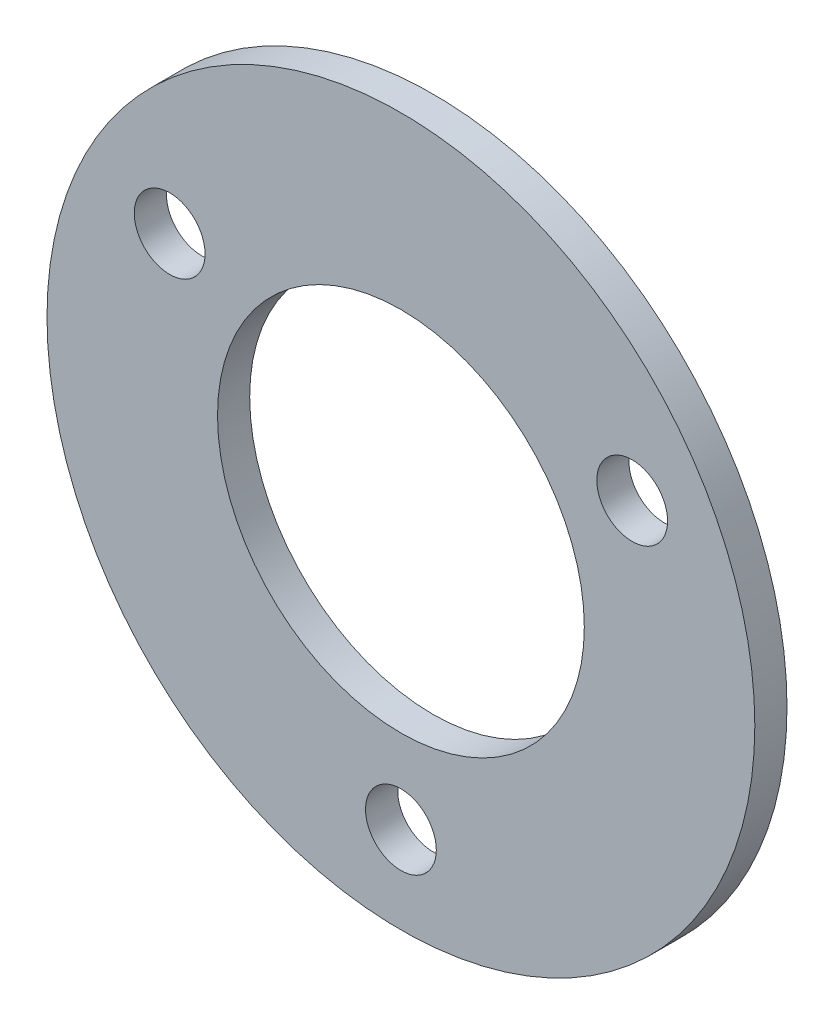
ISO-10303-21;
HEADER;
FILE_DESCRIPTION(('STEP AP214'),'2;1');
FILE_NAME('part.step','',(''),(''),'','','');
FILE_SCHEMA(('AUTOMOTIVE_DESIGN { 1 0 10303 214 1 1 1 1 }'));
ENDSEC;
DATA;
#1=APPLICATION_CONTEXT('core data for automotive mechanical design processes');
#2=APPLICATION_PROTOCOL_DEFINITION('international standard','automotive_design',2000,#1);
#3=PRODUCT_CONTEXT('',#1,'mechanical');
#4=PRODUCT('Part','Part','',(#3));
#5=PRODUCT_RELATED_PRODUCT_CATEGORY('part','',(#4));
#6=PRODUCT_DEFINITION_FORMATION('','',#4);
#7=PRODUCT_DEFINITION_CONTEXT('part definition',#1,'design');
#8=PRODUCT_DEFINITION('design','',#6,#7);
#9=PRODUCT_DEFINITION_SHAPE('','',#8);
#10=(LENGTH_UNIT() NAMED_UNIT(*) SI_UNIT(.MILLI.,.METRE.));
#11=(NAMED_UNIT(*) PLANE_ANGLE_UNIT() SI_UNIT($,.RADIAN.));
#12=(NAMED_UNIT(*) SI_UNIT($,.STERADIAN.) SOLID_ANGLE_UNIT());
#13=UNCERTAINTY_MEASURE_WITH_UNIT(LENGTH_MEASURE(1.E-05),#10,'distance_accuracy_value','');
#14=(GEOMETRIC_REPRESENTATION_CONTEXT(3) GLOBAL_UNCERTAINTY_ASSIGNED_CONTEXT((#13)) GLOBAL_UNIT_ASSIGNED_CONTEXT((#10,
#11,#12)) REPRESENTATION_CONTEXT('',''));
#15=CARTESIAN_POINT('',(0.,0.,0.));
#16=DIRECTION('',(0.,0.,1.));
#17=DIRECTION('',(1.,0.,0.));
#18=AXIS2_PLACEMENT_3D('',#15,#16,#17);
#19=CARTESIAN_POINT('',(0.,0.,1.));
#20=DIRECTION('',(0.,0.,1.));
#21=DIRECTION('',(1.,0.,0.));
#22=AXIS2_PLACEMENT_3D('',#19,#20,#21);
#23=PLANE('',#22);
#24=CARTESIAN_POINT('',(-7.18801085141084,4.15,1.));
#25=DIRECTION('',(0.,0.,1.));
#26=DIRECTION('',(1.,0.,0.));
#27=AXIS2_PLACEMENT_3D('',#24,#25,#26);
#28=CIRCLE('',#27,1.1);
#29=CARTESIAN_POINT('',(-6.08801085141084,4.15,1.));
#30=VERTEX_POINT('',#29);
#31=EDGE_CURVE('E56',#30,#30,#28,.T.);
#32=ORIENTED_EDGE('',*,*,#31,.F.);
#33=EDGE_LOOP('',(#32));
#34=FACE_BOUND('',#33,.T.);
#35=CARTESIAN_POINT('',(0.,0.,1.));
#36=DIRECTION('',(0.,0.,1.));
#37=DIRECTION('',(1.,0.,0.));
#38=AXIS2_PLACEMENT_3D('',#35,#36,#37);
#39=CIRCLE('',#38,5.7);
#40=CARTESIAN_POINT('',(5.7,0.,1.));
#41=VERTEX_POINT('',#40);
#42=EDGE_CURVE('E48',#41,#41,#39,.T.);
#43=ORIENTED_EDGE('',*,*,#42,.F.);
#44=EDGE_LOOP('',(#43));
#45=FACE_BOUND('',#44,.T.);
#46=CARTESIAN_POINT('',(0.,0.,1.));
#47=DIRECTION('',(0.,0.,1.));
#48=DIRECTION('',(1.,0.,0.));
#49=AXIS2_PLACEMENT_3D('',#46,#47,#48);
#50=CIRCLE('',#49,11.);
#51=CARTESIAN_POINT('',(11.,0.,1.));
#52=VERTEX_POINT('',#51);
#53=EDGE_CURVE('E10',#52,#52,#50,.T.);
#54=ORIENTED_EDGE('',*,*,#53,.T.);
#55=EDGE_LOOP('',(#54));
#56=FACE_BOUND('',#55,.T.);
#57=CARTESIAN_POINT('',(7.18801085141084,4.15,1.));
#58=DIRECTION('',(0.,0.,1.));
#59=DIRECTION('',(1.,0.,0.));
#60=AXIS2_PLACEMENT_3D('',#57,#58,#59);
#61=CIRCLE('',#60,1.1);
#62=CARTESIAN_POINT('',(8.28801085141084,4.15,1.));
#63=VERTEX_POINT('',#62);
#64=EDGE_CURVE('E52',#63,#63,#61,.T.);
#65=ORIENTED_EDGE('',*,*,#64,.F.);
#66=EDGE_LOOP('',(#65));
#67=FACE_BOUND('',#66,.T.);
#68=CARTESIAN_POINT('',(0.,-8.3,1.));
#69=DIRECTION('',(0.,0.,1.));
#70=DIRECTION('',(1.,0.,0.));
#71=AXIS2_PLACEMENT_3D('',#68,#69,#70);
#72=CIRCLE('',#71,1.1);
#73=CARTESIAN_POINT('',(1.1,-8.3,1.));
#74=VERTEX_POINT('',#73);
#75=EDGE_CURVE('E63',#74,#74,#72,.T.);
#76=ORIENTED_EDGE('',*,*,#75,.F.);
#77=EDGE_LOOP('',(#76));
#78=FACE_BOUND('',#77,.T.);
#79=ADVANCED_FACE('F40',(#34,#45,#56,#67,#78),#23,.T.);
#80=CARTESIAN_POINT('',(0.,0.,0.));
#81=DIRECTION('',(0.,0.,1.));
#82=DIRECTION('',(1.,0.,0.));
#83=AXIS2_PLACEMENT_3D('',#80,#81,#82);
#84=PLANE('',#83);
#85=CARTESIAN_POINT('',(0.,0.,0.));
#86=DIRECTION('',(0.,0.,1.));
#87=DIRECTION('',(1.,0.,0.));
#88=AXIS2_PLACEMENT_3D('',#85,#86,#87);
#89=CIRCLE('',#88,11.);
#90=CARTESIAN_POINT('',(11.,0.,0.));
#91=VERTEX_POINT('',#90);
#92=EDGE_CURVE('E41',#91,#91,#89,.T.);
#93=ORIENTED_EDGE('',*,*,#92,.F.);
#94=EDGE_LOOP('',(#93));
#95=FACE_BOUND('',#94,.T.);
#96=CARTESIAN_POINT('',(0.,0.,0.));
#97=DIRECTION('',(0.,0.,1.));
#98=DIRECTION('',(1.,0.,0.));
#99=AXIS2_PLACEMENT_3D('',#96,#97,#98);
#100=CIRCLE('',#99,5.7);
#101=CARTESIAN_POINT('',(5.7,0.,0.));
#102=VERTEX_POINT('',#101);
#103=EDGE_CURVE('E49',#102,#102,#100,.T.);
#104=ORIENTED_EDGE('',*,*,#103,.T.);
#105=EDGE_LOOP('',(#104));
#106=FACE_BOUND('',#105,.T.);
#107=CARTESIAN_POINT('',(7.18801085141084,4.15,0.));
#108=DIRECTION('',(0.,0.,1.));
#109=DIRECTION('',(1.,0.,0.));
#110=AXIS2_PLACEMENT_3D('',#107,#108,#109);
#111=CIRCLE('',#110,1.1);
#112=CARTESIAN_POINT('',(8.28801085141084,4.15,0.));
#113=VERTEX_POINT('',#112);
#114=EDGE_CURVE('E57',#113,#113,#111,.T.);
#115=ORIENTED_EDGE('',*,*,#114,.T.);
#116=EDGE_LOOP('',(#115));
#117=FACE_BOUND('',#116,.T.);
#118=CARTESIAN_POINT('',(-7.18801085141084,4.15,0.));
#119=DIRECTION('',(0.,0.,1.));
#120=DIRECTION('',(1.,0.,0.));
#121=AXIS2_PLACEMENT_3D('',#118,#119,#120);
#122=CIRCLE('',#121,1.1);
#123=CARTESIAN_POINT('',(-6.08801085141084,4.15,0.));
#124=VERTEX_POINT('',#123);
#125=EDGE_CURVE('E64',#124,#124,#122,.T.);
#126=ORIENTED_EDGE('',*,*,#125,.T.);
#127=EDGE_LOOP('',(#126));
#128=FACE_BOUND('',#127,.T.);
#129=CARTESIAN_POINT('',(0.,-8.3,0.));
#130=DIRECTION('',(0.,0.,1.));
#131=DIRECTION('',(1.,0.,0.));
#132=AXIS2_PLACEMENT_3D('',#129,#130,#131);
#133=CIRCLE('',#132,1.1);
#134=CARTESIAN_POINT('',(1.1,-8.3,0.));
#135=VERTEX_POINT('',#134);
#136=EDGE_CURVE('E66',#135,#135,#133,.T.);
#137=ORIENTED_EDGE('',*,*,#136,.T.);
#138=EDGE_LOOP('',(#137));
#139=FACE_BOUND('',#138,.T.);
#140=ADVANCED_FACE('F76',(#95,#106,#117,#128,#139),#84,.F.);
#141=CARTESIAN_POINT('',(0.,0.,1.));
#142=DIRECTION('',(0.,0.,-1.));
#143=DIRECTION('',(-1.,0.,0.));
#144=AXIS2_PLACEMENT_3D('',#141,#142,#143);
#145=CYLINDRICAL_SURFACE('',#144,11.);
#146=ORIENTED_EDGE('',*,*,#53,.F.);
#147=EDGE_LOOP('',(#146));
#148=FACE_BOUND('',#147,.T.);
#149=ORIENTED_EDGE('',*,*,#92,.T.);
#150=EDGE_LOOP('',(#149));
#151=FACE_BOUND('',#150,.T.);
#152=ADVANCED_FACE('F39',(#148,#151),#145,.T.);
#153=CARTESIAN_POINT('',(0.,0.,1.));
#154=DIRECTION('',(0.,0.,-1.));
#155=DIRECTION('',(-1.,0.,0.));
#156=AXIS2_PLACEMENT_3D('',#153,#154,#155);
#157=CYLINDRICAL_SURFACE('',#156,5.7);
#158=ORIENTED_EDGE('',*,*,#42,.T.);
#159=EDGE_LOOP('',(#158));
#160=FACE_BOUND('',#159,.T.);
#161=ORIENTED_EDGE('',*,*,#103,.F.);
#162=EDGE_LOOP('',(#161));
#163=FACE_BOUND('',#162,.T.);
#164=ADVANCED_FACE('F88',(#160,#163),#157,.F.);
#165=CARTESIAN_POINT('',(7.18801085141084,4.15,1.));
#166=DIRECTION('',(0.,0.,-1.));
#167=DIRECTION('',(-1.,0.,0.));
#168=AXIS2_PLACEMENT_3D('',#165,#166,#167);
#169=CYLINDRICAL_SURFACE('',#168,1.1);
#170=ORIENTED_EDGE('',*,*,#64,.T.);
#171=EDGE_LOOP('',(#170));
#172=FACE_BOUND('',#171,.T.);
#173=ORIENTED_EDGE('',*,*,#114,.F.);
#174=EDGE_LOOP('',(#173));
#175=FACE_BOUND('',#174,.T.);
#176=ADVANCED_FACE('F91',(#172,#175),#169,.F.);
#177=CARTESIAN_POINT('',(-7.18801085141084,4.15,1.));
#178=DIRECTION('',(0.,0.,-1.));
#179=DIRECTION('',(-1.,0.,0.));
#180=AXIS2_PLACEMENT_3D('',#177,#178,#179);
#181=CYLINDRICAL_SURFACE('',#180,1.1);
#182=ORIENTED_EDGE('',*,*,#31,.T.);
#183=EDGE_LOOP('',(#182));
#184=FACE_BOUND('',#183,.T.);
#185=ORIENTED_EDGE('',*,*,#125,.F.);
#186=EDGE_LOOP('',(#185));
#187=FACE_BOUND('',#186,.T.);
#188=ADVANCED_FACE('F94',(#184,#187),#181,.F.);
#189=CARTESIAN_POINT('',(0.,-8.3,1.));
#190=DIRECTION('',(0.,0.,-1.));
#191=DIRECTION('',(-1.,0.,0.));
#192=AXIS2_PLACEMENT_3D('',#189,#190,#191);
#193=CYLINDRICAL_SURFACE('',#192,1.1);
#194=ORIENTED_EDGE('',*,*,#75,.T.);
#195=EDGE_LOOP('',(#194));
#196=FACE_BOUND('',#195,.T.);
#197=ORIENTED_EDGE('',*,*,#136,.F.);
#198=EDGE_LOOP('',(#197));
#199=FACE_BOUND('',#198,.T.);
#200=ADVANCED_FACE('F71',(#196,#199),#193,.F.);
#201=CLOSED_SHELL('',(#79,#140,#152,#164,#176,#188,#200));
#202=MANIFOLD_SOLID_BREP('B2',#201);
#203=ADVANCED_BREP_SHAPE_REPRESENTATION('',(#18,#202),#14);
#204=SHAPE_DEFINITION_REPRESENTATION(#9,#203);
ENDSEC;
END-ISO-10303-21;
